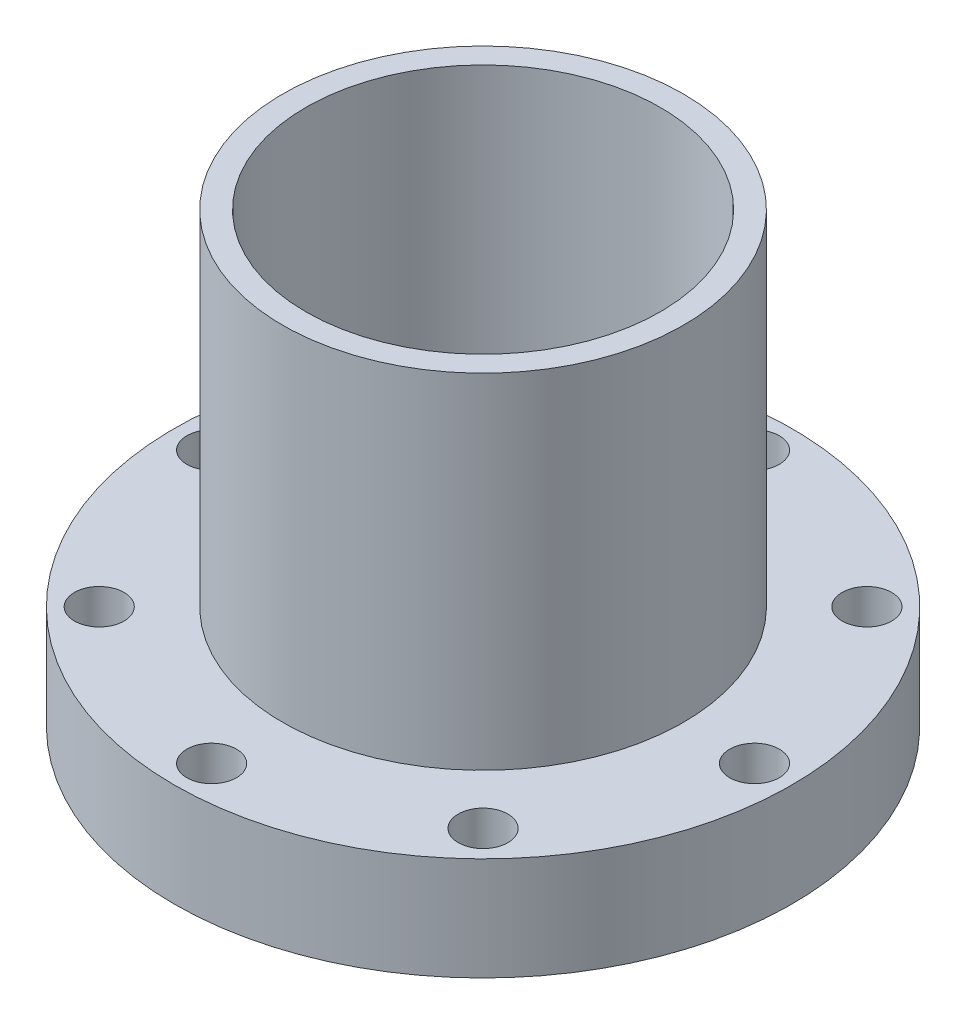
ISO-10303-21;
HEADER;
FILE_DESCRIPTION(('STEP AP214'),'2;1');
FILE_NAME('part.step','',(''),(''),'','','');
FILE_SCHEMA(('AUTOMOTIVE_DESIGN { 1 0 10303 214 1 1 1 1 }'));
ENDSEC;
DATA;
#1=APPLICATION_CONTEXT('core data for automotive mechanical design processes');
#2=APPLICATION_PROTOCOL_DEFINITION('international standard','automotive_design',2000,#1);
#3=PRODUCT_CONTEXT('',#1,'mechanical');
#4=PRODUCT('Part','Part','',(#3));
#5=PRODUCT_RELATED_PRODUCT_CATEGORY('part','',(#4));
#6=PRODUCT_DEFINITION_FORMATION('','',#4);
#7=PRODUCT_DEFINITION_CONTEXT('part definition',#1,'design');
#8=PRODUCT_DEFINITION('design','',#6,#7);
#9=PRODUCT_DEFINITION_SHAPE('','',#8);
#10=(LENGTH_UNIT() NAMED_UNIT(*) SI_UNIT(.MILLI.,.METRE.));
#11=(NAMED_UNIT(*) PLANE_ANGLE_UNIT() SI_UNIT($,.RADIAN.));
#12=(NAMED_UNIT(*) SI_UNIT($,.STERADIAN.) SOLID_ANGLE_UNIT());
#13=UNCERTAINTY_MEASURE_WITH_UNIT(LENGTH_MEASURE(1.E-05),#10,'distance_accuracy_value','');
#14=(GEOMETRIC_REPRESENTATION_CONTEXT(3) GLOBAL_UNCERTAINTY_ASSIGNED_CONTEXT((#13)) GLOBAL_UNIT_ASSIGNED_CONTEXT((#10,
#11,#12)) REPRESENTATION_CONTEXT('',''));
#15=CARTESIAN_POINT('',(0.,0.,0.));
#16=DIRECTION('',(0.,0.,1.));
#17=DIRECTION('',(1.,0.,0.));
#18=AXIS2_PLACEMENT_3D('',#15,#16,#17);
#19=CARTESIAN_POINT('',(0.,-17.526,0.));
#20=DIRECTION('',(0.,1.,0.));
#21=DIRECTION('',(0.,0.,1.));
#22=AXIS2_PLACEMENT_3D('',#19,#20,#21);
#23=PLANE('',#22);
#24=CARTESIAN_POINT('',(-32.2664926729564,-17.526,13.3652188753514));
#25=DIRECTION('',(0.,-1.,0.));
#26=DIRECTION('',(0.,0.,-1.));
#27=AXIS2_PLACEMENT_3D('',#24,#25,#26);
#28=CIRCLE('',#27,2.55269999999999);
#29=CARTESIAN_POINT('',(-32.2664926729564,-17.526,10.8125188753514));
#30=VERTEX_POINT('',#29);
#31=EDGE_CURVE('E82',#30,#30,#28,.T.);
#32=ORIENTED_EDGE('',*,*,#31,.F.);
#33=EDGE_LOOP('',(#32));
#34=FACE_BOUND('',#33,.T.);
#35=CARTESIAN_POINT('',(-13.3652188753512,-17.526,-32.2664926729565));
#36=DIRECTION('',(0.,-1.,0.));
#37=DIRECTION('',(0.,0.,-1.));
#38=AXIS2_PLACEMENT_3D('',#35,#36,#37);
#39=CIRCLE('',#38,2.55269999999999);
#40=CARTESIAN_POINT('',(-13.3652188753512,-17.526,-34.8191926729565));
#41=VERTEX_POINT('',#40);
#42=EDGE_CURVE('E94',#41,#41,#39,.T.);
#43=ORIENTED_EDGE('',*,*,#42,.F.);
#44=EDGE_LOOP('',(#43));
#45=FACE_BOUND('',#44,.T.);
#46=CARTESIAN_POINT('',(0.,-17.526,0.));
#47=DIRECTION('',(0.,1.,0.));
#48=DIRECTION('',(0.,0.,1.));
#49=AXIS2_PLACEMENT_3D('',#46,#47,#48);
#50=CIRCLE('',#49,52.451);
#51=CARTESIAN_POINT('',(0.,-17.526,52.451));
#52=VERTEX_POINT('',#51);
#53=EDGE_CURVE('E176',#52,#52,#50,.T.);
#54=ORIENTED_EDGE('',*,*,#53,.F.);
#55=EDGE_LOOP('',(#54));
#56=FACE_BOUND('',#55,.T.);
#57=CARTESIAN_POINT('',(0.,-17.526,0.));
#58=DIRECTION('',(0.,1.,0.));
#59=DIRECTION('',(0.,0.,1.));
#60=AXIS2_PLACEMENT_3D('',#57,#58,#59);
#61=CIRCLE('',#60,30.099);
#62=CARTESIAN_POINT('',(0.,-17.526,30.099));
#63=VERTEX_POINT('',#62);
#64=EDGE_CURVE('E172',#63,#63,#61,.T.);
#65=ORIENTED_EDGE('',*,*,#64,.T.);
#66=EDGE_LOOP('',(#65));
#67=FACE_BOUND('',#66,.T.);
#68=CARTESIAN_POINT('',(0.,-17.526,-46.101));
#69=DIRECTION('',(0.,1.,0.));
#70=DIRECTION('',(0.,0.,1.));
#71=AXIS2_PLACEMENT_3D('',#68,#69,#70);
#72=CIRCLE('',#71,4.2164);
#73=CARTESIAN_POINT('',(0.,-17.526,-41.8846));
#74=VERTEX_POINT('',#73);
#75=EDGE_CURVE('E164',#74,#74,#72,.T.);
#76=ORIENTED_EDGE('',*,*,#75,.T.);
#77=EDGE_LOOP('',(#76));
#78=FACE_BOUND('',#77,.T.);
#79=CARTESIAN_POINT('',(-32.5983297194811,-17.526,-32.598329719481));
#80=DIRECTION('',(0.,1.,0.));
#81=DIRECTION('',(0.707106781186549,0.,0.707106781186546));
#82=AXIS2_PLACEMENT_3D('',#79,#80,#81);
#83=CIRCLE('',#82,4.2164);
#84=CARTESIAN_POINT('',(-29.6168846872861,-17.526,-29.616884687286));
#85=VERTEX_POINT('',#84);
#86=EDGE_CURVE('E158',#85,#85,#83,.T.);
#87=ORIENTED_EDGE('',*,*,#86,.T.);
#88=EDGE_LOOP('',(#87));
#89=FACE_BOUND('',#88,.T.);
#90=CARTESIAN_POINT('',(-46.101,-17.526,1.60960874430504E-13));
#91=DIRECTION('',(0.,1.,0.));
#92=DIRECTION('',(1.,0.,0.));
#93=AXIS2_PLACEMENT_3D('',#90,#91,#92);
#94=CIRCLE('',#93,4.2164);
#95=CARTESIAN_POINT('',(-41.8846,-17.526,1.46239383986722E-13));
#96=VERTEX_POINT('',#95);
#97=EDGE_CURVE('E152',#96,#96,#94,.T.);
#98=ORIENTED_EDGE('',*,*,#97,.T.);
#99=EDGE_LOOP('',(#98));
#100=FACE_BOUND('',#99,.T.);
#101=CARTESIAN_POINT('',(-32.5983297194809,-17.526,32.5983297194812));
#102=DIRECTION('',(0.,1.,0.));
#103=DIRECTION('',(0.707106781186544,0.,-0.707106781186551));
#104=AXIS2_PLACEMENT_3D('',#101,#102,#103);
#105=CIRCLE('',#104,4.2164);
#106=CARTESIAN_POINT('',(-29.6168846872859,-17.526,29.6168846872862));
#107=VERTEX_POINT('',#106);
#108=EDGE_CURVE('E146',#107,#107,#105,.T.);
#109=ORIENTED_EDGE('',*,*,#108,.T.);
#110=EDGE_LOOP('',(#109));
#111=FACE_BOUND('',#110,.T.);
#112=CARTESIAN_POINT('',(3.21921748861007E-13,-17.526,46.101));
#113=DIRECTION('',(0.,1.,0.));
#114=DIRECTION('',(0.,0.,-1.));
#115=AXIS2_PLACEMENT_3D('',#112,#113,#114);
#116=CIRCLE('',#115,4.2164);
#117=CARTESIAN_POINT('',(2.92478767973444E-13,-17.526,41.8846));
#118=VERTEX_POINT('',#117);
#119=EDGE_CURVE('E140',#118,#118,#116,.T.);
#120=ORIENTED_EDGE('',*,*,#119,.T.);
#121=EDGE_LOOP('',(#120));
#122=FACE_BOUND('',#121,.T.);
#123=CARTESIAN_POINT('',(32.5983297194813,-17.526,32.5983297194807));
#124=DIRECTION('',(0.,1.,0.));
#125=DIRECTION('',(-0.707106781186554,0.,-0.707106781186541));
#126=AXIS2_PLACEMENT_3D('',#123,#124,#125);
#127=CIRCLE('',#126,4.2164);
#128=CARTESIAN_POINT('',(29.6168846872863,-17.526,29.6168846872858));
#129=VERTEX_POINT('',#128);
#130=EDGE_CURVE('E134',#129,#129,#127,.T.);
#131=ORIENTED_EDGE('',*,*,#130,.T.);
#132=EDGE_LOOP('',(#131));
#133=FACE_BOUND('',#132,.T.);
#134=CARTESIAN_POINT('',(46.101,-17.526,-4.82882623291511E-13));
#135=DIRECTION('',(0.,1.,0.));
#136=DIRECTION('',(-1.,0.,0.));
#137=AXIS2_PLACEMENT_3D('',#134,#135,#136);
#138=CIRCLE('',#137,4.2164);
#139=CARTESIAN_POINT('',(41.8846,-17.526,-4.38718151960166E-13));
#140=VERTEX_POINT('',#139);
#141=EDGE_CURVE('E128',#140,#140,#138,.T.);
#142=ORIENTED_EDGE('',*,*,#141,.T.);
#143=EDGE_LOOP('',(#142));
#144=FACE_BOUND('',#143,.T.);
#145=CARTESIAN_POINT('',(32.5983297194806,-17.526,-32.5983297194814));
#146=DIRECTION('',(0.,1.,0.));
#147=DIRECTION('',(-0.707106781186539,0.,0.707106781186556));
#148=AXIS2_PLACEMENT_3D('',#145,#146,#147);
#149=CIRCLE('',#148,4.2164);
#150=CARTESIAN_POINT('',(29.6168846872857,-17.526,-29.6168846872864));
#151=VERTEX_POINT('',#150);
#152=EDGE_CURVE('E122',#151,#151,#149,.T.);
#153=ORIENTED_EDGE('',*,*,#152,.T.);
#154=EDGE_LOOP('',(#153));
#155=FACE_BOUND('',#154,.T.);
#156=CARTESIAN_POINT('',(13.365218875351,-17.526,32.2664926729566));
#157=DIRECTION('',(0.,-1.,0.));
#158=DIRECTION('',(0.,0.,-1.));
#159=AXIS2_PLACEMENT_3D('',#156,#157,#158);
#160=CIRCLE('',#159,2.55269999999999);
#161=CARTESIAN_POINT('',(13.365218875351,-17.526,29.7137926729566));
#162=VERTEX_POINT('',#161);
#163=EDGE_CURVE('E118',#162,#162,#160,.T.);
#164=ORIENTED_EDGE('',*,*,#163,.F.);
#165=EDGE_LOOP('',(#164));
#166=FACE_BOUND('',#165,.T.);
#167=CARTESIAN_POINT('',(32.2664926729568,-17.526,13.3652188753504));
#168=DIRECTION('',(0.,-1.,0.));
#169=DIRECTION('',(0.,0.,-1.));
#170=AXIS2_PLACEMENT_3D('',#167,#168,#169);
#171=CIRCLE('',#170,2.55269999999999);
#172=CARTESIAN_POINT('',(32.2664926729568,-17.526,10.8125188753504));
#173=VERTEX_POINT('',#172);
#174=EDGE_CURVE('E112',#173,#173,#171,.T.);
#175=ORIENTED_EDGE('',*,*,#174,.F.);
#176=EDGE_LOOP('',(#175));
#177=FACE_BOUND('',#176,.T.);
#178=CARTESIAN_POINT('',(32.2664926729565,-17.526,-13.3652188753511));
#179=DIRECTION('',(0.,-1.,0.));
#180=DIRECTION('',(0.,0.,-1.));
#181=AXIS2_PLACEMENT_3D('',#178,#179,#180);
#182=CIRCLE('',#181,2.55269999999999);
#183=CARTESIAN_POINT('',(32.2664926729565,-17.526,-15.9179188753511));
#184=VERTEX_POINT('',#183);
#185=EDGE_CURVE('E106',#184,#184,#182,.T.);
#186=ORIENTED_EDGE('',*,*,#185,.F.);
#187=EDGE_LOOP('',(#186));
#188=FACE_BOUND('',#187,.T.);
#189=CARTESIAN_POINT('',(13.3652188753503,-17.526,-32.2664926729569));
#190=DIRECTION('',(0.,-1.,0.));
#191=DIRECTION('',(0.,0.,-1.));
#192=AXIS2_PLACEMENT_3D('',#189,#190,#191);
#193=CIRCLE('',#192,2.55269999999999);
#194=CARTESIAN_POINT('',(13.3652188753503,-17.526,-34.8191926729569));
#195=VERTEX_POINT('',#194);
#196=EDGE_CURVE('E100',#195,#195,#193,.T.);
#197=ORIENTED_EDGE('',*,*,#196,.F.);
#198=EDGE_LOOP('',(#197));
#199=FACE_BOUND('',#198,.T.);
#200=CARTESIAN_POINT('',(-32.2664926729569,-17.526,-13.3652188753502));
#201=DIRECTION('',(0.,-1.,0.));
#202=DIRECTION('',(0.,0.,-1.));
#203=AXIS2_PLACEMENT_3D('',#200,#201,#202);
#204=CIRCLE('',#203,2.55269999999999);
#205=CARTESIAN_POINT('',(-32.2664926729569,-17.526,-15.9179188753502));
#206=VERTEX_POINT('',#205);
#207=EDGE_CURVE('E88',#206,#206,#204,.T.);
#208=ORIENTED_EDGE('',*,*,#207,.F.);
#209=EDGE_LOOP('',(#208));
#210=FACE_BOUND('',#209,.T.);
#211=CARTESIAN_POINT('',(-13.3652188753501,-17.526,32.266492672957));
#212=DIRECTION('',(0.,-1.,0.));
#213=DIRECTION('',(0.,0.,-1.));
#214=AXIS2_PLACEMENT_3D('',#211,#212,#213);
#215=CIRCLE('',#214,2.55269999999999);
#216=CARTESIAN_POINT('',(-13.3652188753501,-17.526,29.713792672957));
#217=VERTEX_POINT('',#216);
#218=EDGE_CURVE('E74',#217,#217,#215,.T.);
#219=ORIENTED_EDGE('',*,*,#218,.F.);
#220=EDGE_LOOP('',(#219));
#221=FACE_BOUND('',#220,.T.);
#222=ADVANCED_FACE('F32',(#34,#45,#56,#67,#78,#89,#100,#111,#122,#133,#144,#155,#166,#177,#188,
#199,#210,#221),#23,.F.);
#223=CARTESIAN_POINT('',(0.,58.42,0.));
#224=DIRECTION('',(0.,-1.,0.));
#225=DIRECTION('',(0.,0.,-1.));
#226=AXIS2_PLACEMENT_3D('',#223,#224,#225);
#227=CYLINDRICAL_SURFACE('',#226,34.036);
#228=CARTESIAN_POINT('',(0.,58.42,0.));
#229=DIRECTION('',(0.,1.,0.));
#230=DIRECTION('',(0.,0.,1.));
#231=AXIS2_PLACEMENT_3D('',#228,#229,#230);
#232=CIRCLE('',#231,34.036);
#233=CARTESIAN_POINT('',(0.,58.42,-34.036));
#234=VERTEX_POINT('',#233);
#235=EDGE_CURVE('E11',#234,#234,#232,.T.);
#236=CARTESIAN_POINT('',(0.,0.,0.));
#237=DIRECTION('',(0.,1.,0.));
#238=DIRECTION('',(0.,0.,1.));
#239=AXIS2_PLACEMENT_3D('',#236,#237,#238);
#240=CIRCLE('',#239,34.036);
#241=CARTESIAN_POINT('',(0.,0.,-34.036));
#242=VERTEX_POINT('',#241);
#243=EDGE_CURVE('E40',#242,#242,#240,.T.);
#244=CARTESIAN_POINT('',(0.,58.42,-34.036));
#245=CARTESIAN_POINT('',(0.,57.8114583333333,-34.036));
#246=CARTESIAN_POINT('',(0.,57.2029166666667,-34.036));
#247=CARTESIAN_POINT('',(0.,55.9858333333333,-34.036));
#248=CARTESIAN_POINT('',(0.,55.3772916666667,-34.036));
#249=CARTESIAN_POINT('',(0.,54.1602083333333,-34.036));
#250=CARTESIAN_POINT('',(0.,53.5516666666667,-34.036));
#251=CARTESIAN_POINT('',(0.,52.3345833333333,-34.036));
#252=CARTESIAN_POINT('',(0.,51.7260416666667,-34.036));
#253=CARTESIAN_POINT('',(0.,50.5089583333333,-34.036));
#254=CARTESIAN_POINT('',(0.,49.9004166666667,-34.036));
#255=CARTESIAN_POINT('',(0.,48.6833333333333,-34.036));
#256=CARTESIAN_POINT('',(0.,48.0747916666667,-34.036));
#257=CARTESIAN_POINT('',(0.,46.8577083333333,-34.036));
#258=CARTESIAN_POINT('',(0.,46.2491666666667,-34.036));
#259=CARTESIAN_POINT('',(0.,45.0320833333333,-34.036));
#260=CARTESIAN_POINT('',(0.,44.4235416666667,-34.036));
#261=CARTESIAN_POINT('',(0.,43.2064583333333,-34.036));
#262=CARTESIAN_POINT('',(0.,42.5979166666667,-34.036));
#263=CARTESIAN_POINT('',(0.,41.3808333333333,-34.036));
#264=CARTESIAN_POINT('',(0.,40.7722916666667,-34.036));
#265=CARTESIAN_POINT('',(0.,39.5552083333333,-34.036));
#266=CARTESIAN_POINT('',(0.,38.9466666666667,-34.036));
#267=CARTESIAN_POINT('',(0.,37.7295833333333,-34.036));
#268=CARTESIAN_POINT('',(0.,37.1210416666667,-34.036));
#269=CARTESIAN_POINT('',(0.,35.9039583333333,-34.036));
#270=CARTESIAN_POINT('',(0.,35.2954166666667,-34.036));
#271=CARTESIAN_POINT('',(0.,34.0783333333333,-34.036));
#272=CARTESIAN_POINT('',(0.,33.4697916666667,-34.036));
#273=CARTESIAN_POINT('',(0.,32.2527083333333,-34.036));
#274=CARTESIAN_POINT('',(0.,31.6441666666667,-34.036));
#275=CARTESIAN_POINT('',(0.,30.4270833333333,-34.036));
#276=CARTESIAN_POINT('',(0.,29.8185416666667,-34.036));
#277=CARTESIAN_POINT('',(0.,28.6014583333333,-34.036));
#278=CARTESIAN_POINT('',(0.,27.9929166666667,-34.036));
#279=CARTESIAN_POINT('',(0.,26.7758333333333,-34.036));
#280=CARTESIAN_POINT('',(0.,26.1672916666667,-34.036));
#281=CARTESIAN_POINT('',(0.,24.9502083333333,-34.036));
#282=CARTESIAN_POINT('',(0.,24.3416666666667,-34.036));
#283=CARTESIAN_POINT('',(0.,23.1245833333333,-34.036));
#284=CARTESIAN_POINT('',(0.,22.5160416666667,-34.036));
#285=CARTESIAN_POINT('',(0.,21.2989583333333,-34.036));
#286=CARTESIAN_POINT('',(0.,20.6904166666667,-34.036));
#287=CARTESIAN_POINT('',(0.,19.4733333333333,-34.036));
#288=CARTESIAN_POINT('',(0.,18.8647916666667,-34.036));
#289=CARTESIAN_POINT('',(0.,17.6477083333333,-34.036));
#290=CARTESIAN_POINT('',(0.,17.0391666666667,-34.036));
#291=CARTESIAN_POINT('',(0.,15.8220833333333,-34.036));
#292=CARTESIAN_POINT('',(0.,15.2135416666667,-34.036));
#293=CARTESIAN_POINT('',(0.,13.9964583333333,-34.036));
#294=CARTESIAN_POINT('',(0.,13.3879166666667,-34.036));
#295=CARTESIAN_POINT('',(0.,12.1708333333333,-34.036));
#296=CARTESIAN_POINT('',(0.,11.5622916666667,-34.036));
#297=CARTESIAN_POINT('',(0.,10.3452083333333,-34.036));
#298=CARTESIAN_POINT('',(0.,9.73666666666667,-34.036));
#299=CARTESIAN_POINT('',(0.,8.51958333333334,-34.036));
#300=CARTESIAN_POINT('',(0.,7.91104166666667,-34.036));
#301=CARTESIAN_POINT('',(0.,6.69395833333333,-34.036));
#302=CARTESIAN_POINT('',(0.,6.08541666666667,-34.036));
#303=CARTESIAN_POINT('',(0.,4.86833333333333,-34.036));
#304=CARTESIAN_POINT('',(0.,4.25979166666667,-34.036));
#305=CARTESIAN_POINT('',(0.,3.04270833333333,-34.036));
#306=CARTESIAN_POINT('',(0.,2.43416666666667,-34.036));
#307=CARTESIAN_POINT('',(0.,1.21708333333333,-34.036));
#308=CARTESIAN_POINT('',(0.,0.608541666666666,-34.036));
#309=CARTESIAN_POINT('',(0.,0.,-34.036));
#310=B_SPLINE_CURVE_WITH_KNOTS('',3,(#244,#245,#246,#247,#248,#249,#250,#251,#252,#253,#254,
#255,#256,#257,#258,#259,#260,#261,#262,#263,#264,#265,#266,#267,#268,#269,#270,#271,#272,#273,
#274,#275,#276,#277,#278,#279,#280,#281,#282,#283,#284,#285,#286,#287,#288,#289,#290,#291,#292,
#293,#294,#295,#296,#297,#298,#299,#300,#301,#302,#303,#304,#305,#306,#307,#308,#309),
.UNSPECIFIED.,.F.,.F.,(4,2,2,2,2,2,2,2,2,2,2,2,2,2,2,2,2,2,2,2,2,2,2,2,2,2,2,2,2,2,2,2,4),(0.,
1.825625,3.65125,5.476875,7.3025,9.128125,10.95375,12.779375,14.605,16.430625,18.25625,
20.081875,21.9075,23.733125,25.55875,27.384375,29.21,31.035625,32.86125,34.686875,36.5125,
38.338125,40.16375,41.989375,43.815,45.640625,47.46625,49.291875,51.1175,52.943125,54.76875,
56.594375,58.42),.UNSPECIFIED.);
#311=EDGE_CURVE('BSEAM34',#234,#242,#310,.T.);
#312=ORIENTED_EDGE('',*,*,#235,.F.);
#313=ORIENTED_EDGE('',*,*,#243,.T.);
#314=ORIENTED_EDGE('',*,*,#311,.T.);
#315=ORIENTED_EDGE('',*,*,#311,.F.);
#316=EDGE_LOOP('',(#312,#314,#313,#315));
#317=FACE_BOUND('',#316,.T.);
#318=ADVANCED_FACE('F34',(#317),#227,.T.);
#319=CARTESIAN_POINT('',(0.,58.42,0.));
#320=DIRECTION('',(0.,1.,0.));
#321=DIRECTION('',(0.,0.,1.));
#322=AXIS2_PLACEMENT_3D('',#319,#320,#321);
#323=PLANE('',#322);
#324=CARTESIAN_POINT('',(0.,58.42,0.));
#325=DIRECTION('',(0.,1.,0.));
#326=DIRECTION('',(0.,0.,1.));
#327=AXIS2_PLACEMENT_3D('',#324,#325,#326);
#328=CIRCLE('',#327,30.099);
#329=CARTESIAN_POINT('',(0.,58.42,30.099));
#330=VERTEX_POINT('',#329);
#331=EDGE_CURVE('E167',#330,#330,#328,.T.);
#332=ORIENTED_EDGE('',*,*,#331,.F.);
#333=EDGE_LOOP('',(#332));
#334=FACE_BOUND('',#333,.T.);
#335=ORIENTED_EDGE('',*,*,#235,.T.);
#336=EDGE_LOOP('',(#335));
#337=FACE_BOUND('',#336,.T.);
#338=ADVANCED_FACE('F187',(#334,#337),#323,.T.);
#339=CARTESIAN_POINT('',(0.,0.,0.));
#340=DIRECTION('',(0.,1.,0.));
#341=DIRECTION('',(0.,0.,1.));
#342=AXIS2_PLACEMENT_3D('',#339,#340,#341);
#343=PLANE('',#342);
#344=CARTESIAN_POINT('',(32.5983297194806,0.,-32.5983297194814));
#345=DIRECTION('',(0.,1.,0.));
#346=DIRECTION('',(-0.707106781186539,0.,0.707106781186556));
#347=AXIS2_PLACEMENT_3D('',#344,#345,#346);
#348=CIRCLE('',#347,4.2164);
#349=CARTESIAN_POINT('',(29.6168846872857,0.,-29.6168846872864));
#350=VERTEX_POINT('',#349);
#351=EDGE_CURVE('E121',#350,#350,#348,.T.);
#352=ORIENTED_EDGE('',*,*,#351,.F.);
#353=EDGE_LOOP('',(#352));
#354=FACE_BOUND('',#353,.T.);
#355=CARTESIAN_POINT('',(46.101,0.,-4.82882623291511E-13));
#356=DIRECTION('',(0.,1.,0.));
#357=DIRECTION('',(-1.,0.,0.));
#358=AXIS2_PLACEMENT_3D('',#355,#356,#357);
#359=CIRCLE('',#358,4.2164);
#360=CARTESIAN_POINT('',(41.8846,0.,-4.38718151960166E-13));
#361=VERTEX_POINT('',#360);
#362=EDGE_CURVE('E125',#361,#361,#359,.T.);
#363=ORIENTED_EDGE('',*,*,#362,.F.);
#364=EDGE_LOOP('',(#363));
#365=FACE_BOUND('',#364,.T.);
#366=CARTESIAN_POINT('',(32.5983297194813,0.,32.5983297194807));
#367=DIRECTION('',(0.,1.,0.));
#368=DIRECTION('',(-0.707106781186554,0.,-0.707106781186541));
#369=AXIS2_PLACEMENT_3D('',#366,#367,#368);
#370=CIRCLE('',#369,4.2164);
#371=CARTESIAN_POINT('',(29.6168846872863,0.,29.6168846872858));
#372=VERTEX_POINT('',#371);
#373=EDGE_CURVE('E131',#372,#372,#370,.T.);
#374=ORIENTED_EDGE('',*,*,#373,.F.);
#375=EDGE_LOOP('',(#374));
#376=FACE_BOUND('',#375,.T.);
#377=CARTESIAN_POINT('',(3.21921748861007E-13,0.,46.101));
#378=DIRECTION('',(0.,1.,0.));
#379=DIRECTION('',(0.,0.,-1.));
#380=AXIS2_PLACEMENT_3D('',#377,#378,#379);
#381=CIRCLE('',#380,4.2164);
#382=CARTESIAN_POINT('',(2.92478767973444E-13,0.,41.8846));
#383=VERTEX_POINT('',#382);
#384=EDGE_CURVE('E137',#383,#383,#381,.T.);
#385=ORIENTED_EDGE('',*,*,#384,.F.);
#386=EDGE_LOOP('',(#385));
#387=FACE_BOUND('',#386,.T.);
#388=CARTESIAN_POINT('',(-32.5983297194809,0.,32.5983297194812));
#389=DIRECTION('',(0.,1.,0.));
#390=DIRECTION('',(0.707106781186544,0.,-0.707106781186551));
#391=AXIS2_PLACEMENT_3D('',#388,#389,#390);
#392=CIRCLE('',#391,4.2164);
#393=CARTESIAN_POINT('',(-29.6168846872859,0.,29.6168846872862));
#394=VERTEX_POINT('',#393);
#395=EDGE_CURVE('E143',#394,#394,#392,.T.);
#396=ORIENTED_EDGE('',*,*,#395,.F.);
#397=EDGE_LOOP('',(#396));
#398=FACE_BOUND('',#397,.T.);
#399=CARTESIAN_POINT('',(-46.101,0.,1.60960874430504E-13));
#400=DIRECTION('',(0.,1.,0.));
#401=DIRECTION('',(1.,0.,0.));
#402=AXIS2_PLACEMENT_3D('',#399,#400,#401);
#403=CIRCLE('',#402,4.2164);
#404=CARTESIAN_POINT('',(-41.8846,0.,1.46239383986722E-13));
#405=VERTEX_POINT('',#404);
#406=EDGE_CURVE('E149',#405,#405,#403,.T.);
#407=ORIENTED_EDGE('',*,*,#406,.F.);
#408=EDGE_LOOP('',(#407));
#409=FACE_BOUND('',#408,.T.);
#410=CARTESIAN_POINT('',(-32.5983297194811,0.,-32.598329719481));
#411=DIRECTION('',(0.,1.,0.));
#412=DIRECTION('',(0.707106781186549,0.,0.707106781186546));
#413=AXIS2_PLACEMENT_3D('',#410,#411,#412);
#414=CIRCLE('',#413,4.2164);
#415=CARTESIAN_POINT('',(-29.6168846872861,0.,-29.616884687286));
#416=VERTEX_POINT('',#415);
#417=EDGE_CURVE('E155',#416,#416,#414,.T.);
#418=ORIENTED_EDGE('',*,*,#417,.F.);
#419=EDGE_LOOP('',(#418));
#420=FACE_BOUND('',#419,.T.);
#421=CARTESIAN_POINT('',(0.,0.,-46.101));
#422=DIRECTION('',(0.,1.,0.));
#423=DIRECTION('',(0.,0.,1.));
#424=AXIS2_PLACEMENT_3D('',#421,#422,#423);
#425=CIRCLE('',#424,4.2164);
#426=CARTESIAN_POINT('',(0.,0.,-41.8846));
#427=VERTEX_POINT('',#426);
#428=EDGE_CURVE('E161',#427,#427,#425,.T.);
#429=ORIENTED_EDGE('',*,*,#428,.F.);
#430=EDGE_LOOP('',(#429));
#431=FACE_BOUND('',#430,.T.);
#432=CARTESIAN_POINT('',(0.,0.,0.));
#433=DIRECTION('',(0.,1.,0.));
#434=DIRECTION('',(0.,0.,1.));
#435=AXIS2_PLACEMENT_3D('',#432,#433,#434);
#436=CIRCLE('',#435,52.451);
#437=CARTESIAN_POINT('',(0.,0.,52.451));
#438=VERTEX_POINT('',#437);
#439=EDGE_CURVE('E175',#438,#438,#436,.T.);
#440=ORIENTED_EDGE('',*,*,#439,.T.);
#441=EDGE_LOOP('',(#440));
#442=FACE_BOUND('',#441,.T.);
#443=ORIENTED_EDGE('',*,*,#243,.F.);
#444=EDGE_LOOP('',(#443));
#445=FACE_BOUND('',#444,.T.);
#446=ADVANCED_FACE('F184',(#354,#365,#376,#387,#398,#409,#420,#431,#442,#445),#343,.T.);
#447=CARTESIAN_POINT('',(0.,-17.526,0.));
#448=DIRECTION('',(0.,1.,0.));
#449=DIRECTION('',(0.,0.,1.));
#450=AXIS2_PLACEMENT_3D('',#447,#448,#449);
#451=CYLINDRICAL_SURFACE('',#450,52.451);
#452=ORIENTED_EDGE('',*,*,#53,.T.);
#453=EDGE_LOOP('',(#452));
#454=FACE_BOUND('',#453,.T.);
#455=ORIENTED_EDGE('',*,*,#439,.F.);
#456=EDGE_LOOP('',(#455));
#457=FACE_BOUND('',#456,.T.);
#458=ADVANCED_FACE('F186',(#454,#457),#451,.T.);
#459=CARTESIAN_POINT('',(0.,-17.526,0.));
#460=DIRECTION('',(0.,1.,0.));
#461=DIRECTION('',(0.,0.,1.));
#462=AXIS2_PLACEMENT_3D('',#459,#460,#461);
#463=CYLINDRICAL_SURFACE('',#462,30.099);
#464=ORIENTED_EDGE('',*,*,#64,.F.);
#465=EDGE_LOOP('',(#464));
#466=FACE_BOUND('',#465,.T.);
#467=ORIENTED_EDGE('',*,*,#331,.T.);
#468=EDGE_LOOP('',(#467));
#469=FACE_BOUND('',#468,.T.);
#470=ADVANCED_FACE('F194',(#466,#469),#463,.F.);
#471=CARTESIAN_POINT('',(0.,-17.526,-46.101));
#472=DIRECTION('',(0.,1.,0.));
#473=DIRECTION('',(0.,0.,1.));
#474=AXIS2_PLACEMENT_3D('',#471,#472,#473);
#475=CYLINDRICAL_SURFACE('',#474,4.2164);
#476=ORIENTED_EDGE('',*,*,#75,.F.);
#477=EDGE_LOOP('',(#476));
#478=FACE_BOUND('',#477,.T.);
#479=ORIENTED_EDGE('',*,*,#428,.T.);
#480=EDGE_LOOP('',(#479));
#481=FACE_BOUND('',#480,.T.);
#482=ADVANCED_FACE('F212',(#478,#481),#475,.F.);
#483=CARTESIAN_POINT('',(-32.5983297194811,-17.526,-32.598329719481));
#484=DIRECTION('',(0.,1.,0.));
#485=DIRECTION('',(0.,0.,1.));
#486=AXIS2_PLACEMENT_3D('',#483,#484,#485);
#487=CYLINDRICAL_SURFACE('',#486,4.2164);
#488=ORIENTED_EDGE('',*,*,#86,.F.);
#489=EDGE_LOOP('',(#488));
#490=FACE_BOUND('',#489,.T.);
#491=ORIENTED_EDGE('',*,*,#417,.T.);
#492=EDGE_LOOP('',(#491));
#493=FACE_BOUND('',#492,.T.);
#494=ADVANCED_FACE('F216',(#490,#493),#487,.F.);
#495=CARTESIAN_POINT('',(-46.101,-17.526,1.60960874430504E-13));
#496=DIRECTION('',(0.,1.,0.));
#497=DIRECTION('',(0.,0.,1.));
#498=AXIS2_PLACEMENT_3D('',#495,#496,#497);
#499=CYLINDRICAL_SURFACE('',#498,4.2164);
#500=ORIENTED_EDGE('',*,*,#97,.F.);
#501=EDGE_LOOP('',(#500));
#502=FACE_BOUND('',#501,.T.);
#503=ORIENTED_EDGE('',*,*,#406,.T.);
#504=EDGE_LOOP('',(#503));
#505=FACE_BOUND('',#504,.T.);
#506=ADVANCED_FACE('F220',(#502,#505),#499,.F.);
#507=CARTESIAN_POINT('',(-32.5983297194809,-17.526,32.5983297194812));
#508=DIRECTION('',(0.,1.,0.));
#509=DIRECTION('',(0.,0.,1.));
#510=AXIS2_PLACEMENT_3D('',#507,#508,#509);
#511=CYLINDRICAL_SURFACE('',#510,4.2164);
#512=ORIENTED_EDGE('',*,*,#108,.F.);
#513=EDGE_LOOP('',(#512));
#514=FACE_BOUND('',#513,.T.);
#515=ORIENTED_EDGE('',*,*,#395,.T.);
#516=EDGE_LOOP('',(#515));
#517=FACE_BOUND('',#516,.T.);
#518=ADVANCED_FACE('F224',(#514,#517),#511,.F.);
#519=CARTESIAN_POINT('',(3.21921748861007E-13,-17.526,46.101));
#520=DIRECTION('',(0.,1.,0.));
#521=DIRECTION('',(0.,0.,1.));
#522=AXIS2_PLACEMENT_3D('',#519,#520,#521);
#523=CYLINDRICAL_SURFACE('',#522,4.2164);
#524=ORIENTED_EDGE('',*,*,#119,.F.);
#525=EDGE_LOOP('',(#524));
#526=FACE_BOUND('',#525,.T.);
#527=ORIENTED_EDGE('',*,*,#384,.T.);
#528=EDGE_LOOP('',(#527));
#529=FACE_BOUND('',#528,.T.);
#530=ADVANCED_FACE('F228',(#526,#529),#523,.F.);
#531=CARTESIAN_POINT('',(32.5983297194813,-17.526,32.5983297194807));
#532=DIRECTION('',(0.,1.,0.));
#533=DIRECTION('',(0.,0.,1.));
#534=AXIS2_PLACEMENT_3D('',#531,#532,#533);
#535=CYLINDRICAL_SURFACE('',#534,4.2164);
#536=ORIENTED_EDGE('',*,*,#130,.F.);
#537=EDGE_LOOP('',(#536));
#538=FACE_BOUND('',#537,.T.);
#539=ORIENTED_EDGE('',*,*,#373,.T.);
#540=EDGE_LOOP('',(#539));
#541=FACE_BOUND('',#540,.T.);
#542=ADVANCED_FACE('F232',(#538,#541),#535,.F.);
#543=CARTESIAN_POINT('',(46.101,-17.526,-4.82882623291511E-13));
#544=DIRECTION('',(0.,1.,0.));
#545=DIRECTION('',(0.,0.,1.));
#546=AXIS2_PLACEMENT_3D('',#543,#544,#545);
#547=CYLINDRICAL_SURFACE('',#546,4.2164);
#548=ORIENTED_EDGE('',*,*,#141,.F.);
#549=EDGE_LOOP('',(#548));
#550=FACE_BOUND('',#549,.T.);
#551=ORIENTED_EDGE('',*,*,#362,.T.);
#552=EDGE_LOOP('',(#551));
#553=FACE_BOUND('',#552,.T.);
#554=ADVANCED_FACE('F236',(#550,#553),#547,.F.);
#555=CARTESIAN_POINT('',(32.5983297194806,-17.526,-32.5983297194814));
#556=DIRECTION('',(0.,1.,0.));
#557=DIRECTION('',(0.,0.,1.));
#558=AXIS2_PLACEMENT_3D('',#555,#556,#557);
#559=CYLINDRICAL_SURFACE('',#558,4.2164);
#560=ORIENTED_EDGE('',*,*,#152,.F.);
#561=EDGE_LOOP('',(#560));
#562=FACE_BOUND('',#561,.T.);
#563=ORIENTED_EDGE('',*,*,#351,.T.);
#564=EDGE_LOOP('',(#563));
#565=FACE_BOUND('',#564,.T.);
#566=ADVANCED_FACE('F240',(#562,#565),#559,.F.);
#567=CARTESIAN_POINT('',(13.365218875351,-17.526,32.2664926729566));
#568=DIRECTION('',(0.,-1.,0.));
#569=DIRECTION('',(0.,0.,-1.));
#570=AXIS2_PLACEMENT_3D('',#567,#568,#569);
#571=CYLINDRICAL_SURFACE('',#570,2.55269999999999);
#572=CARTESIAN_POINT('',(13.365218875351,-3.556,32.2664926729566));
#573=DIRECTION('',(0.,-1.,0.));
#574=DIRECTION('',(0.,0.,-1.));
#575=AXIS2_PLACEMENT_3D('',#572,#573,#574);
#576=CIRCLE('',#575,2.5527);
#577=CARTESIAN_POINT('',(13.365218875351,-3.556,29.7137926729566));
#578=VERTEX_POINT('',#577);
#579=EDGE_CURVE('E115',#578,#578,#576,.T.);
#580=ORIENTED_EDGE('',*,*,#579,.F.);
#581=EDGE_LOOP('',(#580));
#582=FACE_BOUND('',#581,.T.);
#583=ORIENTED_EDGE('',*,*,#163,.T.);
#584=EDGE_LOOP('',(#583));
#585=FACE_BOUND('',#584,.T.);
#586=ADVANCED_FACE('F244',(#582,#585),#571,.F.);
#587=CARTESIAN_POINT('',(13.365218875351,-3.556,32.2664926729566));
#588=DIRECTION('',(0.,-1.,0.));
#589=DIRECTION('',(0.,0.,-1.));
#590=AXIS2_PLACEMENT_3D('',#587,#588,#589);
#591=CONICAL_SURFACE('',#590,2.5527,1.02974425867665);
#592=CARTESIAN_POINT('',(13.365218875351,-2.02218309780834,32.2664926729566));
#593=VERTEX_POINT('',#592);
#594=VERTEX_LOOP('',#593);
#595=FACE_BOUND('',#594,.T.);
#596=ORIENTED_EDGE('',*,*,#579,.T.);
#597=EDGE_LOOP('',(#596));
#598=FACE_BOUND('',#597,.T.);
#599=ADVANCED_FACE('F248',(#595,#598),#591,.F.);
#600=CARTESIAN_POINT('',(32.2664926729568,-17.526,13.3652188753504));
#601=DIRECTION('',(0.,-1.,0.));
#602=DIRECTION('',(0.,0.,-1.));
#603=AXIS2_PLACEMENT_3D('',#600,#601,#602);
#604=CYLINDRICAL_SURFACE('',#603,2.55269999999999);
#605=CARTESIAN_POINT('',(32.2664926729568,-3.556,13.3652188753504));
#606=DIRECTION('',(0.,-1.,0.));
#607=DIRECTION('',(0.,0.,-1.));
#608=AXIS2_PLACEMENT_3D('',#605,#606,#607);
#609=CIRCLE('',#608,2.5527);
#610=CARTESIAN_POINT('',(32.2664926729568,-3.556,10.8125188753504));
#611=VERTEX_POINT('',#610);
#612=EDGE_CURVE('E109',#611,#611,#609,.T.);
#613=ORIENTED_EDGE('',*,*,#612,.F.);
#614=EDGE_LOOP('',(#613));
#615=FACE_BOUND('',#614,.T.);
#616=ORIENTED_EDGE('',*,*,#174,.T.);
#617=EDGE_LOOP('',(#616));
#618=FACE_BOUND('',#617,.T.);
#619=ADVANCED_FACE('F252',(#615,#618),#604,.F.);
#620=CARTESIAN_POINT('',(32.2664926729568,-3.556,13.3652188753504));
#621=DIRECTION('',(0.,-1.,0.));
#622=DIRECTION('',(0.,0.,-1.));
#623=AXIS2_PLACEMENT_3D('',#620,#621,#622);
#624=CONICAL_SURFACE('',#623,2.5527,1.02974425867665);
#625=CARTESIAN_POINT('',(32.2664926729568,-2.02218309780834,13.3652188753504));
#626=VERTEX_POINT('',#625);
#627=VERTEX_LOOP('',#626);
#628=FACE_BOUND('',#627,.T.);
#629=ORIENTED_EDGE('',*,*,#612,.T.);
#630=EDGE_LOOP('',(#629));
#631=FACE_BOUND('',#630,.T.);
#632=ADVANCED_FACE('F255',(#628,#631),#624,.F.);
#633=CARTESIAN_POINT('',(32.2664926729565,-17.526,-13.3652188753511));
#634=DIRECTION('',(0.,-1.,0.));
#635=DIRECTION('',(0.,0.,-1.));
#636=AXIS2_PLACEMENT_3D('',#633,#634,#635);
#637=CYLINDRICAL_SURFACE('',#636,2.55269999999999);
#638=CARTESIAN_POINT('',(32.2664926729565,-3.556,-13.3652188753511));
#639=DIRECTION('',(0.,-1.,0.));
#640=DIRECTION('',(0.,0.,-1.));
#641=AXIS2_PLACEMENT_3D('',#638,#639,#640);
#642=CIRCLE('',#641,2.5527);
#643=CARTESIAN_POINT('',(32.2664926729565,-3.556,-15.9179188753511));
#644=VERTEX_POINT('',#643);
#645=EDGE_CURVE('E103',#644,#644,#642,.T.);
#646=ORIENTED_EDGE('',*,*,#645,.F.);
#647=EDGE_LOOP('',(#646));
#648=FACE_BOUND('',#647,.T.);
#649=ORIENTED_EDGE('',*,*,#185,.T.);
#650=EDGE_LOOP('',(#649));
#651=FACE_BOUND('',#650,.T.);
#652=ADVANCED_FACE('F259',(#648,#651),#637,.F.);
#653=CARTESIAN_POINT('',(32.2664926729565,-3.556,-13.3652188753511));
#654=DIRECTION('',(0.,-1.,0.));
#655=DIRECTION('',(0.,0.,-1.));
#656=AXIS2_PLACEMENT_3D('',#653,#654,#655);
#657=CONICAL_SURFACE('',#656,2.5527,1.02974425867665);
#658=CARTESIAN_POINT('',(32.2664926729565,-2.02218309780834,-13.3652188753511));
#659=VERTEX_POINT('',#658);
#660=VERTEX_LOOP('',#659);
#661=FACE_BOUND('',#660,.T.);
#662=ORIENTED_EDGE('',*,*,#645,.T.);
#663=EDGE_LOOP('',(#662));
#664=FACE_BOUND('',#663,.T.);
#665=ADVANCED_FACE('F262',(#661,#664),#657,.F.);
#666=CARTESIAN_POINT('',(13.3652188753503,-17.526,-32.2664926729569));
#667=DIRECTION('',(0.,-1.,0.));
#668=DIRECTION('',(0.,0.,-1.));
#669=AXIS2_PLACEMENT_3D('',#666,#667,#668);
#670=CYLINDRICAL_SURFACE('',#669,2.55269999999999);
#671=CARTESIAN_POINT('',(13.3652188753503,-3.556,-32.2664926729569));
#672=DIRECTION('',(0.,-1.,0.));
#673=DIRECTION('',(0.,0.,-1.));
#674=AXIS2_PLACEMENT_3D('',#671,#672,#673);
#675=CIRCLE('',#674,2.5527);
#676=CARTESIAN_POINT('',(13.3652188753503,-3.556,-34.8191926729569));
#677=VERTEX_POINT('',#676);
#678=EDGE_CURVE('E97',#677,#677,#675,.T.);
#679=ORIENTED_EDGE('',*,*,#678,.F.);
#680=EDGE_LOOP('',(#679));
#681=FACE_BOUND('',#680,.T.);
#682=ORIENTED_EDGE('',*,*,#196,.T.);
#683=EDGE_LOOP('',(#682));
#684=FACE_BOUND('',#683,.T.);
#685=ADVANCED_FACE('F266',(#681,#684),#670,.F.);
#686=CARTESIAN_POINT('',(13.3652188753503,-3.556,-32.2664926729569));
#687=DIRECTION('',(0.,-1.,0.));
#688=DIRECTION('',(0.,0.,-1.));
#689=AXIS2_PLACEMENT_3D('',#686,#687,#688);
#690=CONICAL_SURFACE('',#689,2.5527,1.02974425867665);
#691=CARTESIAN_POINT('',(13.3652188753503,-2.02218309780834,-32.2664926729569));
#692=VERTEX_POINT('',#691);
#693=VERTEX_LOOP('',#692);
#694=FACE_BOUND('',#693,.T.);
#695=ORIENTED_EDGE('',*,*,#678,.T.);
#696=EDGE_LOOP('',(#695));
#697=FACE_BOUND('',#696,.T.);
#698=ADVANCED_FACE('F270',(#694,#697),#690,.F.);
#699=CARTESIAN_POINT('',(-13.3652188753512,-17.526,-32.2664926729565));
#700=DIRECTION('',(0.,-1.,0.));
#701=DIRECTION('',(0.,0.,-1.));
#702=AXIS2_PLACEMENT_3D('',#699,#700,#701);
#703=CYLINDRICAL_SURFACE('',#702,2.55269999999999);
#704=CARTESIAN_POINT('',(-13.3652188753512,-3.556,-32.2664926729565));
#705=DIRECTION('',(0.,-1.,0.));
#706=DIRECTION('',(0.,0.,-1.));
#707=AXIS2_PLACEMENT_3D('',#704,#705,#706);
#708=CIRCLE('',#707,2.5527);
#709=CARTESIAN_POINT('',(-13.3652188753512,-3.556,-34.8191926729565));
#710=VERTEX_POINT('',#709);
#711=EDGE_CURVE('E91',#710,#710,#708,.T.);
#712=ORIENTED_EDGE('',*,*,#711,.F.);
#713=EDGE_LOOP('',(#712));
#714=FACE_BOUND('',#713,.T.);
#715=ORIENTED_EDGE('',*,*,#42,.T.);
#716=EDGE_LOOP('',(#715));
#717=FACE_BOUND('',#716,.T.);
#718=ADVANCED_FACE('F274',(#714,#717),#703,.F.);
#719=CARTESIAN_POINT('',(-13.3652188753512,-3.556,-32.2664926729565));
#720=DIRECTION('',(0.,-1.,0.));
#721=DIRECTION('',(0.,0.,-1.));
#722=AXIS2_PLACEMENT_3D('',#719,#720,#721);
#723=CONICAL_SURFACE('',#722,2.5527,1.02974425867665);
#724=CARTESIAN_POINT('',(-13.3652188753513,-2.02218309780834,-32.2664926729565));
#725=VERTEX_POINT('',#724);
#726=VERTEX_LOOP('',#725);
#727=FACE_BOUND('',#726,.T.);
#728=ORIENTED_EDGE('',*,*,#711,.T.);
#729=EDGE_LOOP('',(#728));
#730=FACE_BOUND('',#729,.T.);
#731=ADVANCED_FACE('F278',(#727,#730),#723,.F.);
#732=CARTESIAN_POINT('',(-32.2664926729569,-17.526,-13.3652188753502));
#733=DIRECTION('',(0.,-1.,0.));
#734=DIRECTION('',(0.,0.,-1.));
#735=AXIS2_PLACEMENT_3D('',#732,#733,#734);
#736=CYLINDRICAL_SURFACE('',#735,2.55269999999999);
#737=CARTESIAN_POINT('',(-32.2664926729569,-3.556,-13.3652188753502));
#738=DIRECTION('',(0.,-1.,0.));
#739=DIRECTION('',(0.,0.,-1.));
#740=AXIS2_PLACEMENT_3D('',#737,#738,#739);
#741=CIRCLE('',#740,2.5527);
#742=CARTESIAN_POINT('',(-32.2664926729569,-3.556,-15.9179188753502));
#743=VERTEX_POINT('',#742);
#744=EDGE_CURVE('E85',#743,#743,#741,.T.);
#745=ORIENTED_EDGE('',*,*,#744,.F.);
#746=EDGE_LOOP('',(#745));
#747=FACE_BOUND('',#746,.T.);
#748=ORIENTED_EDGE('',*,*,#207,.T.);
#749=EDGE_LOOP('',(#748));
#750=FACE_BOUND('',#749,.T.);
#751=ADVANCED_FACE('F282',(#747,#750),#736,.F.);
#752=CARTESIAN_POINT('',(-32.2664926729569,-3.556,-13.3652188753502));
#753=DIRECTION('',(0.,-1.,0.));
#754=DIRECTION('',(0.,0.,-1.));
#755=AXIS2_PLACEMENT_3D('',#752,#753,#754);
#756=CONICAL_SURFACE('',#755,2.5527,1.02974425867665);
#757=CARTESIAN_POINT('',(-32.2664926729569,-2.02218309780834,-13.3652188753502));
#758=VERTEX_POINT('',#757);
#759=VERTEX_LOOP('',#758);
#760=FACE_BOUND('',#759,.T.);
#761=ORIENTED_EDGE('',*,*,#744,.T.);
#762=EDGE_LOOP('',(#761));
#763=FACE_BOUND('',#762,.T.);
#764=ADVANCED_FACE('F286',(#760,#763),#756,.F.);
#765=CARTESIAN_POINT('',(-32.2664926729564,-17.526,13.3652188753514));
#766=DIRECTION('',(0.,-1.,0.));
#767=DIRECTION('',(0.,0.,-1.));
#768=AXIS2_PLACEMENT_3D('',#765,#766,#767);
#769=CYLINDRICAL_SURFACE('',#768,2.55269999999999);
#770=CARTESIAN_POINT('',(-32.2664926729564,-3.556,13.3652188753514));
#771=DIRECTION('',(0.,-1.,0.));
#772=DIRECTION('',(0.,0.,-1.));
#773=AXIS2_PLACEMENT_3D('',#770,#771,#772);
#774=CIRCLE('',#773,2.5527);
#775=CARTESIAN_POINT('',(-32.2664926729564,-3.556,10.8125188753514));
#776=VERTEX_POINT('',#775);
#777=EDGE_CURVE('E77',#776,#776,#774,.T.);
#778=ORIENTED_EDGE('',*,*,#777,.F.);
#779=EDGE_LOOP('',(#778));
#780=FACE_BOUND('',#779,.T.);
#781=ORIENTED_EDGE('',*,*,#31,.T.);
#782=EDGE_LOOP('',(#781));
#783=FACE_BOUND('',#782,.T.);
#784=ADVANCED_FACE('F290',(#780,#783),#769,.F.);
#785=CARTESIAN_POINT('',(-32.2664926729564,-3.556,13.3652188753514));
#786=DIRECTION('',(0.,-1.,0.));
#787=DIRECTION('',(0.,0.,-1.));
#788=AXIS2_PLACEMENT_3D('',#785,#786,#787);
#789=CONICAL_SURFACE('',#788,2.5527,1.02974425867665);
#790=CARTESIAN_POINT('',(-32.2664926729564,-2.02218309780834,13.3652188753514));
#791=VERTEX_POINT('',#790);
#792=VERTEX_LOOP('',#791);
#793=FACE_BOUND('',#792,.T.);
#794=ORIENTED_EDGE('',*,*,#777,.T.);
#795=EDGE_LOOP('',(#794));
#796=FACE_BOUND('',#795,.T.);
#797=ADVANCED_FACE('F294',(#793,#796),#789,.F.);
#798=CARTESIAN_POINT('',(-13.3652188753501,-17.526,32.266492672957));
#799=DIRECTION('',(0.,-1.,0.));
#800=DIRECTION('',(0.,0.,-1.));
#801=AXIS2_PLACEMENT_3D('',#798,#799,#800);
#802=CYLINDRICAL_SURFACE('',#801,2.55269999999999);
#803=CARTESIAN_POINT('',(-13.3652188753501,-3.556,32.266492672957));
#804=DIRECTION('',(0.,-1.,0.));
#805=DIRECTION('',(0.,0.,-1.));
#806=AXIS2_PLACEMENT_3D('',#803,#804,#805);
#807=CIRCLE('',#806,2.5527);
#808=CARTESIAN_POINT('',(-13.3652188753501,-3.556,29.713792672957));
#809=VERTEX_POINT('',#808);
#810=EDGE_CURVE('E72',#809,#809,#807,.T.);
#811=ORIENTED_EDGE('',*,*,#810,.F.);
#812=EDGE_LOOP('',(#811));
#813=FACE_BOUND('',#812,.T.);
#814=ORIENTED_EDGE('',*,*,#218,.T.);
#815=EDGE_LOOP('',(#814));
#816=FACE_BOUND('',#815,.T.);
#817=ADVANCED_FACE('F68',(#813,#816),#802,.F.);
#818=CARTESIAN_POINT('',(-13.3652188753501,-3.556,32.266492672957));
#819=DIRECTION('',(0.,-1.,0.));
#820=DIRECTION('',(0.,0.,-1.));
#821=AXIS2_PLACEMENT_3D('',#818,#819,#820);
#822=CONICAL_SURFACE('',#821,2.5527,1.02974425867665);
#823=CARTESIAN_POINT('',(-13.3652188753501,-2.02218309780834,32.266492672957));
#824=VERTEX_POINT('',#823);
#825=VERTEX_LOOP('',#824);
#826=FACE_BOUND('',#825,.T.);
#827=ORIENTED_EDGE('',*,*,#810,.T.);
#828=EDGE_LOOP('',(#827));
#829=FACE_BOUND('',#828,.T.);
#830=ADVANCED_FACE('F65',(#826,#829),#822,.F.);
#831=CLOSED_SHELL('',(#222,#318,#338,#446,#458,#470,#482,#494,#506,#518,#530,#542,#554,#566,
#586,#599,#619,#632,#652,#665,#685,#698,#718,#731,#751,#764,#784,#797,#817,#830));
#832=MANIFOLD_SOLID_BREP('B2',#831);
#833=ADVANCED_BREP_SHAPE_REPRESENTATION('',(#18,#832),#14);
#834=SHAPE_DEFINITION_REPRESENTATION(#9,#833);
ENDSEC;
END-ISO-10303-21;
